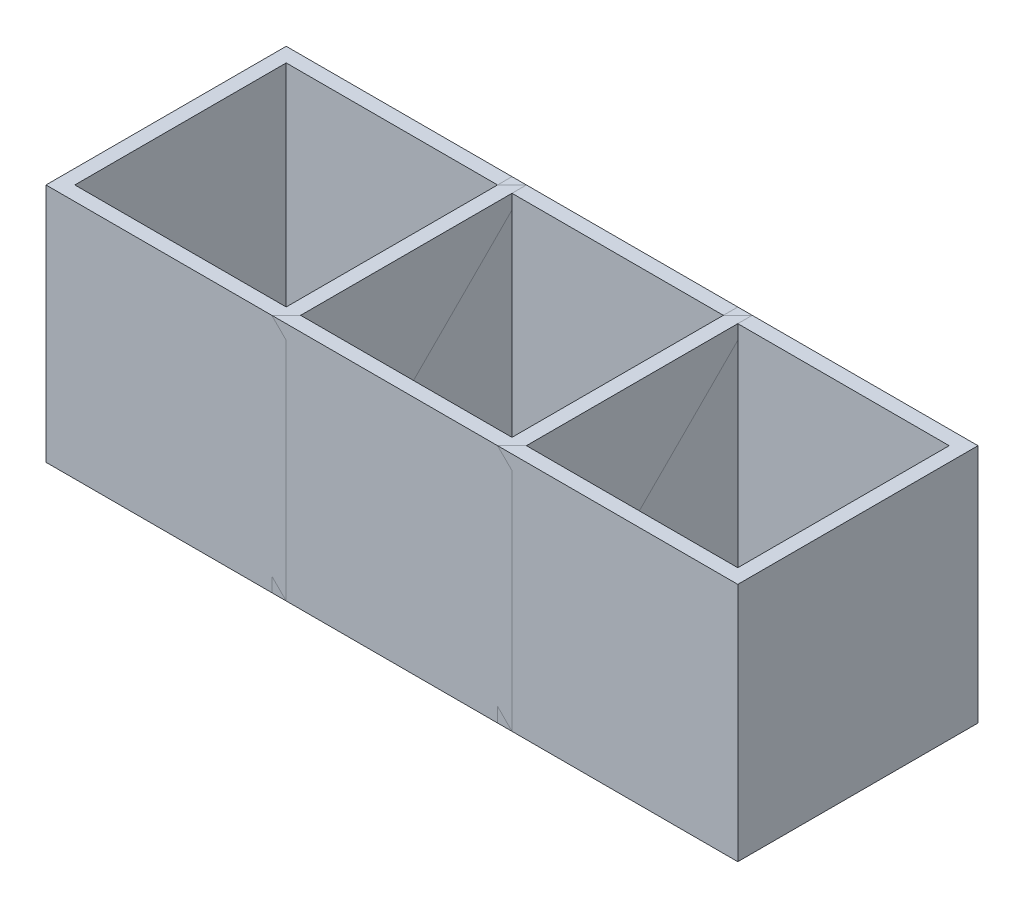
ISO-10303-21;
HEADER;
FILE_DESCRIPTION(('STEP AP214'),'2;1');
FILE_NAME('part.step','',(''),(''),'','','');
FILE_SCHEMA(('AUTOMOTIVE_DESIGN { 1 0 10303 214 1 1 1 1 }'));
ENDSEC;
DATA;
#1=APPLICATION_CONTEXT('core data for automotive mechanical design processes');
#2=APPLICATION_PROTOCOL_DEFINITION('international standard','automotive_design',2000,#1);
#3=PRODUCT_CONTEXT('',#1,'mechanical');
#4=PRODUCT('Part','Part','',(#3));
#5=PRODUCT_RELATED_PRODUCT_CATEGORY('part','',(#4));
#6=PRODUCT_DEFINITION_FORMATION('','',#4);
#7=PRODUCT_DEFINITION_CONTEXT('part definition',#1,'design');
#8=PRODUCT_DEFINITION('design','',#6,#7);
#9=PRODUCT_DEFINITION_SHAPE('','',#8);
#10=(LENGTH_UNIT() NAMED_UNIT(*) SI_UNIT(.MILLI.,.METRE.));
#11=(NAMED_UNIT(*) PLANE_ANGLE_UNIT() SI_UNIT($,.RADIAN.));
#12=(NAMED_UNIT(*) SI_UNIT($,.STERADIAN.) SOLID_ANGLE_UNIT());
#13=UNCERTAINTY_MEASURE_WITH_UNIT(LENGTH_MEASURE(1.E-05),#10,'distance_accuracy_value','');
#14=(GEOMETRIC_REPRESENTATION_CONTEXT(3) GLOBAL_UNCERTAINTY_ASSIGNED_CONTEXT((#13)) GLOBAL_UNIT_ASSIGNED_CONTEXT((#10,
#11,#12)) REPRESENTATION_CONTEXT('',''));
#15=CARTESIAN_POINT('',(0.,0.,0.));
#16=DIRECTION('',(0.,0.,1.));
#17=DIRECTION('',(1.,0.,0.));
#18=AXIS2_PLACEMENT_3D('',#15,#16,#17);
#19=CARTESIAN_POINT('',(69.,50.,-25.));
#20=DIRECTION('',(1.,0.,0.));
#21=DIRECTION('',(0.,0.,-1.));
#22=AXIS2_PLACEMENT_3D('',#19,#20,#21);
#23=PLANE('',#22);
#24=DIRECTION('',(0.,0.,1.));
#25=VECTOR('',#24,1.);
#26=CARTESIAN_POINT('',(69.,0.,-25.));
#27=LINE('',#26,#25);
#28=CARTESIAN_POINT('',(69.,0.,-25.));
#29=VERTEX_POINT('',#28);
#30=CARTESIAN_POINT('',(69.,0.,25.));
#31=VERTEX_POINT('',#30);
#32=EDGE_CURVE('E163',#29,#31,#27,.T.);
#33=ORIENTED_EDGE('',*,*,#32,.T.);
#34=DIRECTION('',(0.,-1.,0.));
#35=VECTOR('',#34,1.);
#36=CARTESIAN_POINT('',(69.,50.,25.));
#37=LINE('',#36,#35);
#38=CARTESIAN_POINT('',(69.,50.,25.));
#39=VERTEX_POINT('',#38);
#40=EDGE_CURVE('E12',#39,#31,#37,.T.);
#41=ORIENTED_EDGE('',*,*,#40,.F.);
#42=DIRECTION('',(0.,0.,1.));
#43=VECTOR('',#42,1.);
#44=CARTESIAN_POINT('',(69.,50.,-25.));
#45=LINE('',#44,#43);
#46=CARTESIAN_POINT('',(69.,50.,-25.));
#47=VERTEX_POINT('',#46);
#48=EDGE_CURVE('E154',#47,#39,#45,.T.);
#49=ORIENTED_EDGE('',*,*,#48,.F.);
#50=DIRECTION('',(0.,-1.,0.));
#51=VECTOR('',#50,1.);
#52=CARTESIAN_POINT('',(69.,50.,-25.));
#53=LINE('',#52,#51);
#54=EDGE_CURVE('E69',#47,#29,#53,.T.);
#55=ORIENTED_EDGE('',*,*,#54,.T.);
#56=EDGE_LOOP('',(#33,#41,#49,#55));
#57=FACE_BOUND('',#56,.T.);
#58=ADVANCED_FACE('F46',(#57),#23,.F.);
#59=CARTESIAN_POINT('',(69.,50.,25.));
#60=DIRECTION('',(0.,0.,-1.));
#61=DIRECTION('',(-1.,0.,0.));
#62=AXIS2_PLACEMENT_3D('',#59,#60,#61);
#63=PLANE('',#62);
#64=DIRECTION('',(1.,0.,0.));
#65=VECTOR('',#64,1.);
#66=CARTESIAN_POINT('',(69.,0.,25.));
#67=LINE('',#66,#65);
#68=CARTESIAN_POINT('',(119.,0.,25.));
#69=VERTEX_POINT('',#68);
#70=EDGE_CURVE('E165',#31,#69,#67,.T.);
#71=ORIENTED_EDGE('',*,*,#70,.T.);
#72=DIRECTION('',(0.,-1.,0.));
#73=VECTOR('',#72,1.);
#74=CARTESIAN_POINT('',(119.,50.,25.));
#75=LINE('',#74,#73);
#76=CARTESIAN_POINT('',(119.,50.,25.));
#77=VERTEX_POINT('',#76);
#78=EDGE_CURVE('E53',#77,#69,#75,.T.);
#79=ORIENTED_EDGE('',*,*,#78,.F.);
#80=DIRECTION('',(1.,0.,0.));
#81=VECTOR('',#80,1.);
#82=CARTESIAN_POINT('',(69.,50.,25.));
#83=LINE('',#82,#81);
#84=EDGE_CURVE('E95',#39,#77,#83,.T.);
#85=ORIENTED_EDGE('',*,*,#84,.F.);
#86=ORIENTED_EDGE('',*,*,#40,.T.);
#87=EDGE_LOOP('',(#71,#79,#85,#86));
#88=FACE_BOUND('',#87,.T.);
#89=ADVANCED_FACE('F179',(#88),#63,.F.);
#90=CARTESIAN_POINT('',(119.,50.,-25.));
#91=DIRECTION('',(1.,0.,0.));
#92=DIRECTION('',(0.,0.,-1.));
#93=AXIS2_PLACEMENT_3D('',#90,#91,#92);
#94=PLANE('',#93);
#95=DIRECTION('',(0.,0.,1.));
#96=VECTOR('',#95,1.);
#97=CARTESIAN_POINT('',(119.,0.,-25.));
#98=LINE('',#97,#96);
#99=CARTESIAN_POINT('',(119.,0.,-25.));
#100=VERTEX_POINT('',#99);
#101=EDGE_CURVE('E168',#100,#69,#98,.T.);
#102=ORIENTED_EDGE('',*,*,#101,.F.);
#103=DIRECTION('',(0.,-1.,0.));
#104=VECTOR('',#103,1.);
#105=CARTESIAN_POINT('',(119.,50.,-25.));
#106=LINE('',#105,#104);
#107=CARTESIAN_POINT('',(119.,50.,-25.));
#108=VERTEX_POINT('',#107);
#109=EDGE_CURVE('E174',#108,#100,#106,.T.);
#110=ORIENTED_EDGE('',*,*,#109,.F.);
#111=DIRECTION('',(0.,0.,1.));
#112=VECTOR('',#111,1.);
#113=CARTESIAN_POINT('',(119.,50.,-25.));
#114=LINE('',#113,#112);
#115=EDGE_CURVE('E158',#108,#77,#114,.T.);
#116=ORIENTED_EDGE('',*,*,#115,.T.);
#117=ORIENTED_EDGE('',*,*,#78,.T.);
#118=EDGE_LOOP('',(#102,#110,#116,#117));
#119=FACE_BOUND('',#118,.T.);
#120=ADVANCED_FACE('F177',(#119),#94,.T.);
#121=CARTESIAN_POINT('',(69.,50.,-25.));
#122=DIRECTION('',(0.,0.,-1.));
#123=DIRECTION('',(-1.,0.,0.));
#124=AXIS2_PLACEMENT_3D('',#121,#122,#123);
#125=PLANE('',#124);
#126=DIRECTION('',(1.,0.,0.));
#127=VECTOR('',#126,1.);
#128=CARTESIAN_POINT('',(69.,0.,-25.));
#129=LINE('',#128,#127);
#130=EDGE_CURVE('E156',#29,#100,#129,.T.);
#131=ORIENTED_EDGE('',*,*,#130,.F.);
#132=ORIENTED_EDGE('',*,*,#54,.F.);
#133=DIRECTION('',(1.,0.,0.));
#134=VECTOR('',#133,1.);
#135=CARTESIAN_POINT('',(69.,50.,-25.));
#136=LINE('',#135,#134);
#137=EDGE_CURVE('E161',#47,#108,#136,.T.);
#138=ORIENTED_EDGE('',*,*,#137,.T.);
#139=ORIENTED_EDGE('',*,*,#109,.T.);
#140=EDGE_LOOP('',(#131,#132,#138,#139));
#141=FACE_BOUND('',#140,.T.);
#142=ADVANCED_FACE('F183',(#141),#125,.T.);
#143=CARTESIAN_POINT('',(94.,50.,0.));
#144=DIRECTION('',(0.,1.,0.));
#145=DIRECTION('',(0.,0.,1.));
#146=AXIS2_PLACEMENT_3D('',#143,#144,#145);
#147=PLANE('',#146);
#148=DIRECTION('',(0.,0.,1.));
#149=VECTOR('',#148,1.);
#150=CARTESIAN_POINT('',(72.,50.,-25.));
#151=LINE('',#150,#149);
#152=CARTESIAN_POINT('',(72.,50.,-22.));
#153=VERTEX_POINT('',#152);
#154=CARTESIAN_POINT('',(72.,50.,22.));
#155=VERTEX_POINT('',#154);
#156=EDGE_CURVE('E144',#153,#155,#151,.T.);
#157=ORIENTED_EDGE('',*,*,#156,.F.);
#158=DIRECTION('',(1.,0.,0.));
#159=VECTOR('',#158,1.);
#160=CARTESIAN_POINT('',(69.,50.,-22.));
#161=LINE('',#160,#159);
#162=CARTESIAN_POINT('',(116.,50.,-22.));
#163=VERTEX_POINT('',#162);
#164=EDGE_CURVE('E125',#153,#163,#161,.T.);
#165=ORIENTED_EDGE('',*,*,#164,.T.);
#166=DIRECTION('',(0.,0.,1.));
#167=VECTOR('',#166,1.);
#168=CARTESIAN_POINT('',(116.,50.,-25.));
#169=LINE('',#168,#167);
#170=CARTESIAN_POINT('',(116.,50.,22.));
#171=VERTEX_POINT('',#170);
#172=EDGE_CURVE('E60',#163,#171,#169,.T.);
#173=ORIENTED_EDGE('',*,*,#172,.T.);
#174=DIRECTION('',(1.,0.,0.));
#175=VECTOR('',#174,1.);
#176=CARTESIAN_POINT('',(69.,50.,22.));
#177=LINE('',#176,#175);
#178=EDGE_CURVE('E146',#155,#171,#177,.T.);
#179=ORIENTED_EDGE('',*,*,#178,.F.);
#180=EDGE_LOOP('',(#157,#165,#173,#179));
#181=FACE_BOUND('',#180,.T.);
#182=ORIENTED_EDGE('',*,*,#48,.T.);
#183=ORIENTED_EDGE('',*,*,#84,.T.);
#184=ORIENTED_EDGE('',*,*,#115,.F.);
#185=ORIENTED_EDGE('',*,*,#137,.F.);
#186=EDGE_LOOP('',(#182,#183,#184,#185));
#187=FACE_BOUND('',#186,.T.);
#188=ADVANCED_FACE('F186',(#181,#187),#147,.T.);
#189=CARTESIAN_POINT('',(94.,0.,0.));
#190=DIRECTION('',(0.,1.,0.));
#191=DIRECTION('',(0.,0.,1.));
#192=AXIS2_PLACEMENT_3D('',#189,#190,#191);
#193=PLANE('',#192);
#194=ORIENTED_EDGE('',*,*,#32,.F.);
#195=ORIENTED_EDGE('',*,*,#130,.T.);
#196=ORIENTED_EDGE('',*,*,#101,.T.);
#197=ORIENTED_EDGE('',*,*,#70,.F.);
#198=EDGE_LOOP('',(#194,#195,#196,#197));
#199=FACE_BOUND('',#198,.T.);
#200=ADVANCED_FACE('F182',(#199),#193,.F.);
#201=CARTESIAN_POINT('',(72.,50.,-25.));
#202=DIRECTION('',(1.,0.,0.));
#203=DIRECTION('',(0.,0.,-1.));
#204=AXIS2_PLACEMENT_3D('',#201,#202,#203);
#205=PLANE('',#204);
#206=DIRECTION('',(0.,0.,1.));
#207=VECTOR('',#206,1.);
#208=CARTESIAN_POINT('',(72.,3.,-25.));
#209=LINE('',#208,#207);
#210=CARTESIAN_POINT('',(72.,3.,-22.));
#211=VERTEX_POINT('',#210);
#212=CARTESIAN_POINT('',(72.,3.,22.));
#213=VERTEX_POINT('',#212);
#214=EDGE_CURVE('E132',#211,#213,#209,.T.);
#215=ORIENTED_EDGE('',*,*,#214,.F.);
#216=DIRECTION('',(0.,-1.,0.));
#217=VECTOR('',#216,1.);
#218=CARTESIAN_POINT('',(72.,50.,-22.));
#219=LINE('',#218,#217);
#220=EDGE_CURVE('E119',#153,#211,#219,.T.);
#221=ORIENTED_EDGE('',*,*,#220,.F.);
#222=ORIENTED_EDGE('',*,*,#156,.T.);
#223=DIRECTION('',(0.,-1.,0.));
#224=VECTOR('',#223,1.);
#225=CARTESIAN_POINT('',(72.,50.,22.));
#226=LINE('',#225,#224);
#227=EDGE_CURVE('E135',#155,#213,#226,.T.);
#228=ORIENTED_EDGE('',*,*,#227,.T.);
#229=EDGE_LOOP('',(#215,#221,#222,#228));
#230=FACE_BOUND('',#229,.T.);
#231=ADVANCED_FACE('F133',(#230),#205,.T.);
#232=CARTESIAN_POINT('',(69.,50.,22.));
#233=DIRECTION('',(0.,0.,-1.));
#234=DIRECTION('',(-1.,0.,0.));
#235=AXIS2_PLACEMENT_3D('',#232,#233,#234);
#236=PLANE('',#235);
#237=DIRECTION('',(1.,0.,0.));
#238=VECTOR('',#237,1.);
#239=CARTESIAN_POINT('',(69.,3.,22.));
#240=LINE('',#239,#238);
#241=CARTESIAN_POINT('',(116.,3.,22.));
#242=VERTEX_POINT('',#241);
#243=EDGE_CURVE('E138',#213,#242,#240,.T.);
#244=ORIENTED_EDGE('',*,*,#243,.F.);
#245=ORIENTED_EDGE('',*,*,#227,.F.);
#246=ORIENTED_EDGE('',*,*,#178,.T.);
#247=DIRECTION('',(0.,-1.,0.));
#248=VECTOR('',#247,1.);
#249=CARTESIAN_POINT('',(116.,50.,22.));
#250=LINE('',#249,#248);
#251=EDGE_CURVE('E278',#171,#242,#250,.T.);
#252=ORIENTED_EDGE('',*,*,#251,.T.);
#253=EDGE_LOOP('',(#244,#245,#246,#252));
#254=FACE_BOUND('',#253,.T.);
#255=ADVANCED_FACE('F210',(#254),#236,.T.);
#256=CARTESIAN_POINT('',(116.,50.,-25.));
#257=DIRECTION('',(1.,0.,0.));
#258=DIRECTION('',(0.,0.,-1.));
#259=AXIS2_PLACEMENT_3D('',#256,#257,#258);
#260=PLANE('',#259);
#261=DIRECTION('',(0.,0.,1.));
#262=VECTOR('',#261,1.);
#263=CARTESIAN_POINT('',(116.,3.,-25.));
#264=LINE('',#263,#262);
#265=CARTESIAN_POINT('',(116.,3.,-22.));
#266=VERTEX_POINT('',#265);
#267=EDGE_CURVE('E143',#266,#242,#264,.T.);
#268=ORIENTED_EDGE('',*,*,#267,.T.);
#269=ORIENTED_EDGE('',*,*,#251,.F.);
#270=ORIENTED_EDGE('',*,*,#172,.F.);
#271=DIRECTION('',(0.,-1.,0.));
#272=VECTOR('',#271,1.);
#273=CARTESIAN_POINT('',(116.,50.,-22.));
#274=LINE('',#273,#272);
#275=EDGE_CURVE('E128',#163,#266,#274,.T.);
#276=ORIENTED_EDGE('',*,*,#275,.T.);
#277=EDGE_LOOP('',(#268,#269,#270,#276));
#278=FACE_BOUND('',#277,.T.);
#279=ADVANCED_FACE('F207',(#278),#260,.F.);
#280=CARTESIAN_POINT('',(69.,50.,-22.));
#281=DIRECTION('',(0.,0.,-1.));
#282=DIRECTION('',(-1.,0.,0.));
#283=AXIS2_PLACEMENT_3D('',#280,#281,#282);
#284=PLANE('',#283);
#285=DIRECTION('',(1.,0.,0.));
#286=VECTOR('',#285,1.);
#287=CARTESIAN_POINT('',(69.,3.,-22.));
#288=LINE('',#287,#286);
#289=EDGE_CURVE('E123',#211,#266,#288,.T.);
#290=ORIENTED_EDGE('',*,*,#289,.T.);
#291=ORIENTED_EDGE('',*,*,#275,.F.);
#292=ORIENTED_EDGE('',*,*,#164,.F.);
#293=ORIENTED_EDGE('',*,*,#220,.T.);
#294=EDGE_LOOP('',(#290,#291,#292,#293));
#295=FACE_BOUND('',#294,.T.);
#296=ADVANCED_FACE('F121',(#295),#284,.F.);
#297=CARTESIAN_POINT('',(94.,3.,0.));
#298=DIRECTION('',(0.,1.,0.));
#299=DIRECTION('',(0.,0.,1.));
#300=AXIS2_PLACEMENT_3D('',#297,#298,#299);
#301=PLANE('',#300);
#302=ORIENTED_EDGE('',*,*,#214,.T.);
#303=ORIENTED_EDGE('',*,*,#243,.T.);
#304=ORIENTED_EDGE('',*,*,#267,.F.);
#305=ORIENTED_EDGE('',*,*,#289,.F.);
#306=EDGE_LOOP('',(#302,#303,#304,#305));
#307=FACE_BOUND('',#306,.T.);
#308=ADVANCED_FACE('F141',(#307),#301,.T.);
#309=CLOSED_SHELL('',(#58,#89,#120,#142,#188,#200,#231,#255,#279,#296,#308));
#310=MANIFOLD_SOLID_BREP('B2',#309);
#311=CARTESIAN_POINT('',(22.,50.,-25.));
#312=DIRECTION('',(1.,0.,0.));
#313=DIRECTION('',(0.,0.,-1.));
#314=AXIS2_PLACEMENT_3D('',#311,#312,#313);
#315=PLANE('',#314);
#316=DIRECTION('',(0.,0.,1.));
#317=VECTOR('',#316,1.);
#318=CARTESIAN_POINT('',(22.,0.,-25.));
#319=LINE('',#318,#317);
#320=CARTESIAN_POINT('',(22.,0.,-25.));
#321=VERTEX_POINT('',#320);
#322=CARTESIAN_POINT('',(22.,0.,25.));
#323=VERTEX_POINT('',#322);
#324=EDGE_CURVE('E411',#321,#323,#319,.T.);
#325=ORIENTED_EDGE('',*,*,#324,.T.);
#326=DIRECTION('',(0.,-1.,0.));
#327=VECTOR('',#326,1.);
#328=CARTESIAN_POINT('',(22.,50.,25.));
#329=LINE('',#328,#327);
#330=CARTESIAN_POINT('',(22.,50.,25.));
#331=VERTEX_POINT('',#330);
#332=EDGE_CURVE('E44',#331,#323,#329,.T.);
#333=ORIENTED_EDGE('',*,*,#332,.F.);
#334=DIRECTION('',(0.,0.,1.));
#335=VECTOR('',#334,1.);
#336=CARTESIAN_POINT('',(22.,50.,-25.));
#337=LINE('',#336,#335);
#338=CARTESIAN_POINT('',(22.,50.,-25.));
#339=VERTEX_POINT('',#338);
#340=EDGE_CURVE('E402',#339,#331,#337,.T.);
#341=ORIENTED_EDGE('',*,*,#340,.F.);
#342=DIRECTION('',(0.,-1.,0.));
#343=VECTOR('',#342,1.);
#344=CARTESIAN_POINT('',(22.,50.,-25.));
#345=LINE('',#344,#343);
#346=EDGE_CURVE('E317',#339,#321,#345,.T.);
#347=ORIENTED_EDGE('',*,*,#346,.T.);
#348=EDGE_LOOP('',(#325,#333,#341,#347));
#349=FACE_BOUND('',#348,.T.);
#350=ADVANCED_FACE('F294',(#349),#315,.F.);
#351=CARTESIAN_POINT('',(22.,50.,25.));
#352=DIRECTION('',(0.,0.,-1.));
#353=DIRECTION('',(-1.,0.,0.));
#354=AXIS2_PLACEMENT_3D('',#351,#352,#353);
#355=PLANE('',#354);
#356=DIRECTION('',(1.,0.,0.));
#357=VECTOR('',#356,1.);
#358=CARTESIAN_POINT('',(22.,0.,25.));
#359=LINE('',#358,#357);
#360=CARTESIAN_POINT('',(72.,0.,25.));
#361=VERTEX_POINT('',#360);
#362=EDGE_CURVE('E413',#323,#361,#359,.T.);
#363=ORIENTED_EDGE('',*,*,#362,.T.);
#364=DIRECTION('',(0.,-1.,0.));
#365=VECTOR('',#364,1.);
#366=CARTESIAN_POINT('',(72.,50.,25.));
#367=LINE('',#366,#365);
#368=CARTESIAN_POINT('',(72.,50.,25.));
#369=VERTEX_POINT('',#368);
#370=EDGE_CURVE('E301',#369,#361,#367,.T.);
#371=ORIENTED_EDGE('',*,*,#370,.F.);
#372=DIRECTION('',(1.,0.,0.));
#373=VECTOR('',#372,1.);
#374=CARTESIAN_POINT('',(22.,50.,25.));
#375=LINE('',#374,#373);
#376=EDGE_CURVE('E343',#331,#369,#375,.T.);
#377=ORIENTED_EDGE('',*,*,#376,.F.);
#378=ORIENTED_EDGE('',*,*,#332,.T.);
#379=EDGE_LOOP('',(#363,#371,#377,#378));
#380=FACE_BOUND('',#379,.T.);
#381=ADVANCED_FACE('F427',(#380),#355,.F.);
#382=CARTESIAN_POINT('',(72.,50.,-25.));
#383=DIRECTION('',(1.,0.,0.));
#384=DIRECTION('',(0.,0.,-1.));
#385=AXIS2_PLACEMENT_3D('',#382,#383,#384);
#386=PLANE('',#385);
#387=DIRECTION('',(0.,0.,1.));
#388=VECTOR('',#387,1.);
#389=CARTESIAN_POINT('',(72.,0.,-25.));
#390=LINE('',#389,#388);
#391=CARTESIAN_POINT('',(72.,0.,-25.));
#392=VERTEX_POINT('',#391);
#393=EDGE_CURVE('E416',#392,#361,#390,.T.);
#394=ORIENTED_EDGE('',*,*,#393,.F.);
#395=DIRECTION('',(0.,-1.,0.));
#396=VECTOR('',#395,1.);
#397=CARTESIAN_POINT('',(72.,50.,-25.));
#398=LINE('',#397,#396);
#399=CARTESIAN_POINT('',(72.,50.,-25.));
#400=VERTEX_POINT('',#399);
#401=EDGE_CURVE('E422',#400,#392,#398,.T.);
#402=ORIENTED_EDGE('',*,*,#401,.F.);
#403=DIRECTION('',(0.,0.,1.));
#404=VECTOR('',#403,1.);
#405=CARTESIAN_POINT('',(72.,50.,-25.));
#406=LINE('',#405,#404);
#407=EDGE_CURVE('E406',#400,#369,#406,.T.);
#408=ORIENTED_EDGE('',*,*,#407,.T.);
#409=ORIENTED_EDGE('',*,*,#370,.T.);
#410=EDGE_LOOP('',(#394,#402,#408,#409));
#411=FACE_BOUND('',#410,.T.);
#412=ADVANCED_FACE('F425',(#411),#386,.T.);
#413=CARTESIAN_POINT('',(22.,50.,-25.));
#414=DIRECTION('',(0.,0.,-1.));
#415=DIRECTION('',(-1.,0.,0.));
#416=AXIS2_PLACEMENT_3D('',#413,#414,#415);
#417=PLANE('',#416);
#418=DIRECTION('',(1.,0.,0.));
#419=VECTOR('',#418,1.);
#420=CARTESIAN_POINT('',(22.,0.,-25.));
#421=LINE('',#420,#419);
#422=EDGE_CURVE('E404',#321,#392,#421,.T.);
#423=ORIENTED_EDGE('',*,*,#422,.F.);
#424=ORIENTED_EDGE('',*,*,#346,.F.);
#425=DIRECTION('',(1.,0.,0.));
#426=VECTOR('',#425,1.);
#427=CARTESIAN_POINT('',(22.,50.,-25.));
#428=LINE('',#427,#426);
#429=EDGE_CURVE('E409',#339,#400,#428,.T.);
#430=ORIENTED_EDGE('',*,*,#429,.T.);
#431=ORIENTED_EDGE('',*,*,#401,.T.);
#432=EDGE_LOOP('',(#423,#424,#430,#431));
#433=FACE_BOUND('',#432,.T.);
#434=ADVANCED_FACE('F431',(#433),#417,.T.);
#435=CARTESIAN_POINT('',(47.,50.,0.));
#436=DIRECTION('',(0.,1.,0.));
#437=DIRECTION('',(0.,0.,1.));
#438=AXIS2_PLACEMENT_3D('',#435,#436,#437);
#439=PLANE('',#438);
#440=DIRECTION('',(0.,0.,1.));
#441=VECTOR('',#440,1.);
#442=CARTESIAN_POINT('',(25.,50.,-25.));
#443=LINE('',#442,#441);
#444=CARTESIAN_POINT('',(25.,50.,-22.));
#445=VERTEX_POINT('',#444);
#446=CARTESIAN_POINT('',(25.,50.,22.));
#447=VERTEX_POINT('',#446);
#448=EDGE_CURVE('E392',#445,#447,#443,.T.);
#449=ORIENTED_EDGE('',*,*,#448,.F.);
#450=DIRECTION('',(1.,0.,0.));
#451=VECTOR('',#450,1.);
#452=CARTESIAN_POINT('',(22.,50.,-22.));
#453=LINE('',#452,#451);
#454=CARTESIAN_POINT('',(69.,50.,-22.));
#455=VERTEX_POINT('',#454);
#456=EDGE_CURVE('E373',#445,#455,#453,.T.);
#457=ORIENTED_EDGE('',*,*,#456,.T.);
#458=DIRECTION('',(0.,0.,1.));
#459=VECTOR('',#458,1.);
#460=CARTESIAN_POINT('',(69.,50.,-25.));
#461=LINE('',#460,#459);
#462=CARTESIAN_POINT('',(69.,50.,22.));
#463=VERTEX_POINT('',#462);
#464=EDGE_CURVE('E308',#455,#463,#461,.T.);
#465=ORIENTED_EDGE('',*,*,#464,.T.);
#466=DIRECTION('',(1.,0.,0.));
#467=VECTOR('',#466,1.);
#468=CARTESIAN_POINT('',(22.,50.,22.));
#469=LINE('',#468,#467);
#470=EDGE_CURVE('E394',#447,#463,#469,.T.);
#471=ORIENTED_EDGE('',*,*,#470,.F.);
#472=EDGE_LOOP('',(#449,#457,#465,#471));
#473=FACE_BOUND('',#472,.T.);
#474=ORIENTED_EDGE('',*,*,#340,.T.);
#475=ORIENTED_EDGE('',*,*,#376,.T.);
#476=ORIENTED_EDGE('',*,*,#407,.F.);
#477=ORIENTED_EDGE('',*,*,#429,.F.);
#478=EDGE_LOOP('',(#474,#475,#476,#477));
#479=FACE_BOUND('',#478,.T.);
#480=ADVANCED_FACE('F434',(#473,#479),#439,.T.);
#481=CARTESIAN_POINT('',(47.,0.,0.));
#482=DIRECTION('',(0.,1.,0.));
#483=DIRECTION('',(0.,0.,1.));
#484=AXIS2_PLACEMENT_3D('',#481,#482,#483);
#485=PLANE('',#484);
#486=ORIENTED_EDGE('',*,*,#324,.F.);
#487=ORIENTED_EDGE('',*,*,#422,.T.);
#488=ORIENTED_EDGE('',*,*,#393,.T.);
#489=ORIENTED_EDGE('',*,*,#362,.F.);
#490=EDGE_LOOP('',(#486,#487,#488,#489));
#491=FACE_BOUND('',#490,.T.);
#492=ADVANCED_FACE('F430',(#491),#485,.F.);
#493=CARTESIAN_POINT('',(25.,50.,-25.));
#494=DIRECTION('',(1.,0.,0.));
#495=DIRECTION('',(0.,0.,-1.));
#496=AXIS2_PLACEMENT_3D('',#493,#494,#495);
#497=PLANE('',#496);
#498=DIRECTION('',(0.,0.,1.));
#499=VECTOR('',#498,1.);
#500=CARTESIAN_POINT('',(25.,3.,-25.));
#501=LINE('',#500,#499);
#502=CARTESIAN_POINT('',(25.,3.,-22.));
#503=VERTEX_POINT('',#502);
#504=CARTESIAN_POINT('',(25.,3.,22.));
#505=VERTEX_POINT('',#504);
#506=EDGE_CURVE('E380',#503,#505,#501,.T.);
#507=ORIENTED_EDGE('',*,*,#506,.F.);
#508=DIRECTION('',(0.,-1.,0.));
#509=VECTOR('',#508,1.);
#510=CARTESIAN_POINT('',(25.,50.,-22.));
#511=LINE('',#510,#509);
#512=EDGE_CURVE('E367',#445,#503,#511,.T.);
#513=ORIENTED_EDGE('',*,*,#512,.F.);
#514=ORIENTED_EDGE('',*,*,#448,.T.);
#515=DIRECTION('',(0.,-1.,0.));
#516=VECTOR('',#515,1.);
#517=CARTESIAN_POINT('',(25.,50.,22.));
#518=LINE('',#517,#516);
#519=EDGE_CURVE('E383',#447,#505,#518,.T.);
#520=ORIENTED_EDGE('',*,*,#519,.T.);
#521=EDGE_LOOP('',(#507,#513,#514,#520));
#522=FACE_BOUND('',#521,.T.);
#523=ADVANCED_FACE('F381',(#522),#497,.T.);
#524=CARTESIAN_POINT('',(22.,50.,22.));
#525=DIRECTION('',(0.,0.,-1.));
#526=DIRECTION('',(-1.,0.,0.));
#527=AXIS2_PLACEMENT_3D('',#524,#525,#526);
#528=PLANE('',#527);
#529=DIRECTION('',(1.,0.,0.));
#530=VECTOR('',#529,1.);
#531=CARTESIAN_POINT('',(22.,3.,22.));
#532=LINE('',#531,#530);
#533=CARTESIAN_POINT('',(69.,3.,22.));
#534=VERTEX_POINT('',#533);
#535=EDGE_CURVE('E386',#505,#534,#532,.T.);
#536=ORIENTED_EDGE('',*,*,#535,.F.);
#537=ORIENTED_EDGE('',*,*,#519,.F.);
#538=ORIENTED_EDGE('',*,*,#470,.T.);
#539=DIRECTION('',(0.,-1.,0.));
#540=VECTOR('',#539,1.);
#541=CARTESIAN_POINT('',(69.,50.,22.));
#542=LINE('',#541,#540);
#543=EDGE_CURVE('E526',#463,#534,#542,.T.);
#544=ORIENTED_EDGE('',*,*,#543,.T.);
#545=EDGE_LOOP('',(#536,#537,#538,#544));
#546=FACE_BOUND('',#545,.T.);
#547=ADVANCED_FACE('F458',(#546),#528,.T.);
#548=CARTESIAN_POINT('',(69.,50.,-25.));
#549=DIRECTION('',(1.,0.,0.));
#550=DIRECTION('',(0.,0.,-1.));
#551=AXIS2_PLACEMENT_3D('',#548,#549,#550);
#552=PLANE('',#551);
#553=DIRECTION('',(0.,0.,1.));
#554=VECTOR('',#553,1.);
#555=CARTESIAN_POINT('',(69.,3.,-25.));
#556=LINE('',#555,#554);
#557=CARTESIAN_POINT('',(69.,3.,-22.));
#558=VERTEX_POINT('',#557);
#559=EDGE_CURVE('E391',#558,#534,#556,.T.);
#560=ORIENTED_EDGE('',*,*,#559,.T.);
#561=ORIENTED_EDGE('',*,*,#543,.F.);
#562=ORIENTED_EDGE('',*,*,#464,.F.);
#563=DIRECTION('',(0.,-1.,0.));
#564=VECTOR('',#563,1.);
#565=CARTESIAN_POINT('',(69.,50.,-22.));
#566=LINE('',#565,#564);
#567=EDGE_CURVE('E376',#455,#558,#566,.T.);
#568=ORIENTED_EDGE('',*,*,#567,.T.);
#569=EDGE_LOOP('',(#560,#561,#562,#568));
#570=FACE_BOUND('',#569,.T.);
#571=ADVANCED_FACE('F455',(#570),#552,.F.);
#572=CARTESIAN_POINT('',(22.,50.,-22.));
#573=DIRECTION('',(0.,0.,-1.));
#574=DIRECTION('',(-1.,0.,0.));
#575=AXIS2_PLACEMENT_3D('',#572,#573,#574);
#576=PLANE('',#575);
#577=DIRECTION('',(1.,0.,0.));
#578=VECTOR('',#577,1.);
#579=CARTESIAN_POINT('',(22.,3.,-22.));
#580=LINE('',#579,#578);
#581=EDGE_CURVE('E371',#503,#558,#580,.T.);
#582=ORIENTED_EDGE('',*,*,#581,.T.);
#583=ORIENTED_EDGE('',*,*,#567,.F.);
#584=ORIENTED_EDGE('',*,*,#456,.F.);
#585=ORIENTED_EDGE('',*,*,#512,.T.);
#586=EDGE_LOOP('',(#582,#583,#584,#585));
#587=FACE_BOUND('',#586,.T.);
#588=ADVANCED_FACE('F369',(#587),#576,.F.);
#589=CARTESIAN_POINT('',(47.,3.,0.));
#590=DIRECTION('',(0.,1.,0.));
#591=DIRECTION('',(0.,0.,1.));
#592=AXIS2_PLACEMENT_3D('',#589,#590,#591);
#593=PLANE('',#592);
#594=ORIENTED_EDGE('',*,*,#506,.T.);
#595=ORIENTED_EDGE('',*,*,#535,.T.);
#596=ORIENTED_EDGE('',*,*,#559,.F.);
#597=ORIENTED_EDGE('',*,*,#581,.F.);
#598=EDGE_LOOP('',(#594,#595,#596,#597));
#599=FACE_BOUND('',#598,.T.);
#600=ADVANCED_FACE('F389',(#599),#593,.T.);
#601=CLOSED_SHELL('',(#350,#381,#412,#434,#480,#492,#523,#547,#571,#588,#600));
#602=MANIFOLD_SOLID_BREP('B6',#601);
#603=CARTESIAN_POINT('',(-25.,50.,-25.));
#604=DIRECTION('',(1.,0.,0.));
#605=DIRECTION('',(0.,0.,-1.));
#606=AXIS2_PLACEMENT_3D('',#603,#604,#605);
#607=PLANE('',#606);
#608=DIRECTION('',(0.,0.,1.));
#609=VECTOR('',#608,1.);
#610=CARTESIAN_POINT('',(-25.,0.,-25.));
#611=LINE('',#610,#609);
#612=CARTESIAN_POINT('',(-25.,0.,-25.));
#613=VERTEX_POINT('',#612);
#614=CARTESIAN_POINT('',(-25.,0.,25.));
#615=VERTEX_POINT('',#614);
#616=EDGE_CURVE('E650',#613,#615,#611,.T.);
#617=ORIENTED_EDGE('',*,*,#616,.T.);
#618=DIRECTION('',(0.,-1.,0.));
#619=VECTOR('',#618,1.);
#620=CARTESIAN_POINT('',(-25.,50.,25.));
#621=LINE('',#620,#619);
#622=CARTESIAN_POINT('',(-25.,50.,25.));
#623=VERTEX_POINT('',#622);
#624=EDGE_CURVE('E292',#623,#615,#621,.T.);
#625=ORIENTED_EDGE('',*,*,#624,.F.);
#626=DIRECTION('',(0.,0.,1.));
#627=VECTOR('',#626,1.);
#628=CARTESIAN_POINT('',(-25.,50.,-25.));
#629=LINE('',#628,#627);
#630=CARTESIAN_POINT('',(-25.,50.,-25.));
#631=VERTEX_POINT('',#630);
#632=EDGE_CURVE('E641',#631,#623,#629,.T.);
#633=ORIENTED_EDGE('',*,*,#632,.F.);
#634=DIRECTION('',(0.,-1.,0.));
#635=VECTOR('',#634,1.);
#636=CARTESIAN_POINT('',(-25.,50.,-25.));
#637=LINE('',#636,#635);
#638=EDGE_CURVE('E556',#631,#613,#637,.T.);
#639=ORIENTED_EDGE('',*,*,#638,.T.);
#640=EDGE_LOOP('',(#617,#625,#633,#639));
#641=FACE_BOUND('',#640,.T.);
#642=ADVANCED_FACE('F533',(#641),#607,.F.);
#643=CARTESIAN_POINT('',(-25.,50.,25.));
#644=DIRECTION('',(0.,0.,-1.));
#645=DIRECTION('',(-1.,0.,0.));
#646=AXIS2_PLACEMENT_3D('',#643,#644,#645);
#647=PLANE('',#646);
#648=DIRECTION('',(1.,0.,0.));
#649=VECTOR('',#648,1.);
#650=CARTESIAN_POINT('',(-25.,0.,25.));
#651=LINE('',#650,#649);
#652=CARTESIAN_POINT('',(25.,0.,25.));
#653=VERTEX_POINT('',#652);
#654=EDGE_CURVE('E652',#615,#653,#651,.T.);
#655=ORIENTED_EDGE('',*,*,#654,.T.);
#656=DIRECTION('',(0.,-1.,0.));
#657=VECTOR('',#656,1.);
#658=CARTESIAN_POINT('',(25.,50.,25.));
#659=LINE('',#658,#657);
#660=CARTESIAN_POINT('',(25.,50.,25.));
#661=VERTEX_POINT('',#660);
#662=EDGE_CURVE('E540',#661,#653,#659,.T.);
#663=ORIENTED_EDGE('',*,*,#662,.F.);
#664=DIRECTION('',(1.,0.,0.));
#665=VECTOR('',#664,1.);
#666=CARTESIAN_POINT('',(-25.,50.,25.));
#667=LINE('',#666,#665);
#668=EDGE_CURVE('E582',#623,#661,#667,.T.);
#669=ORIENTED_EDGE('',*,*,#668,.F.);
#670=ORIENTED_EDGE('',*,*,#624,.T.);
#671=EDGE_LOOP('',(#655,#663,#669,#670));
#672=FACE_BOUND('',#671,.T.);
#673=ADVANCED_FACE('F666',(#672),#647,.F.);
#674=CARTESIAN_POINT('',(25.,50.,-25.));
#675=DIRECTION('',(1.,0.,0.));
#676=DIRECTION('',(0.,0.,-1.));
#677=AXIS2_PLACEMENT_3D('',#674,#675,#676);
#678=PLANE('',#677);
#679=DIRECTION('',(0.,0.,1.));
#680=VECTOR('',#679,1.);
#681=CARTESIAN_POINT('',(25.,0.,-25.));
#682=LINE('',#681,#680);
#683=CARTESIAN_POINT('',(25.,0.,-25.));
#684=VERTEX_POINT('',#683);
#685=EDGE_CURVE('E655',#684,#653,#682,.T.);
#686=ORIENTED_EDGE('',*,*,#685,.F.);
#687=DIRECTION('',(0.,-1.,0.));
#688=VECTOR('',#687,1.);
#689=CARTESIAN_POINT('',(25.,50.,-25.));
#690=LINE('',#689,#688);
#691=CARTESIAN_POINT('',(25.,50.,-25.));
#692=VERTEX_POINT('',#691);
#693=EDGE_CURVE('E661',#692,#684,#690,.T.);
#694=ORIENTED_EDGE('',*,*,#693,.F.);
#695=DIRECTION('',(0.,0.,1.));
#696=VECTOR('',#695,1.);
#697=CARTESIAN_POINT('',(25.,50.,-25.));
#698=LINE('',#697,#696);
#699=EDGE_CURVE('E645',#692,#661,#698,.T.);
#700=ORIENTED_EDGE('',*,*,#699,.T.);
#701=ORIENTED_EDGE('',*,*,#662,.T.);
#702=EDGE_LOOP('',(#686,#694,#700,#701));
#703=FACE_BOUND('',#702,.T.);
#704=ADVANCED_FACE('F664',(#703),#678,.T.);
#705=CARTESIAN_POINT('',(-25.,50.,-25.));
#706=DIRECTION('',(0.,0.,-1.));
#707=DIRECTION('',(-1.,0.,0.));
#708=AXIS2_PLACEMENT_3D('',#705,#706,#707);
#709=PLANE('',#708);
#710=DIRECTION('',(1.,0.,0.));
#711=VECTOR('',#710,1.);
#712=CARTESIAN_POINT('',(-25.,0.,-25.));
#713=LINE('',#712,#711);
#714=EDGE_CURVE('E643',#613,#684,#713,.T.);
#715=ORIENTED_EDGE('',*,*,#714,.F.);
#716=ORIENTED_EDGE('',*,*,#638,.F.);
#717=DIRECTION('',(1.,0.,0.));
#718=VECTOR('',#717,1.);
#719=CARTESIAN_POINT('',(-25.,50.,-25.));
#720=LINE('',#719,#718);
#721=EDGE_CURVE('E648',#631,#692,#720,.T.);
#722=ORIENTED_EDGE('',*,*,#721,.T.);
#723=ORIENTED_EDGE('',*,*,#693,.T.);
#724=EDGE_LOOP('',(#715,#716,#722,#723));
#725=FACE_BOUND('',#724,.T.);
#726=ADVANCED_FACE('F670',(#725),#709,.T.);
#727=CARTESIAN_POINT('',(0.,50.,0.));
#728=DIRECTION('',(0.,1.,0.));
#729=DIRECTION('',(0.,0.,1.));
#730=AXIS2_PLACEMENT_3D('',#727,#728,#729);
#731=PLANE('',#730);
#732=DIRECTION('',(0.,0.,1.));
#733=VECTOR('',#732,1.);
#734=CARTESIAN_POINT('',(-22.,50.,-25.));
#735=LINE('',#734,#733);
#736=CARTESIAN_POINT('',(-22.,50.,-22.));
#737=VERTEX_POINT('',#736);
#738=CARTESIAN_POINT('',(-22.,50.,22.));
#739=VERTEX_POINT('',#738);
#740=EDGE_CURVE('E631',#737,#739,#735,.T.);
#741=ORIENTED_EDGE('',*,*,#740,.F.);
#742=DIRECTION('',(1.,0.,0.));
#743=VECTOR('',#742,1.);
#744=CARTESIAN_POINT('',(-25.,50.,-22.));
#745=LINE('',#744,#743);
#746=CARTESIAN_POINT('',(22.,50.,-22.));
#747=VERTEX_POINT('',#746);
#748=EDGE_CURVE('E612',#737,#747,#745,.T.);
#749=ORIENTED_EDGE('',*,*,#748,.T.);
#750=DIRECTION('',(0.,0.,1.));
#751=VECTOR('',#750,1.);
#752=CARTESIAN_POINT('',(22.,50.,-25.));
#753=LINE('',#752,#751);
#754=CARTESIAN_POINT('',(22.,50.,22.));
#755=VERTEX_POINT('',#754);
#756=EDGE_CURVE('E547',#747,#755,#753,.T.);
#757=ORIENTED_EDGE('',*,*,#756,.T.);
#758=DIRECTION('',(1.,0.,0.));
#759=VECTOR('',#758,1.);
#760=CARTESIAN_POINT('',(-25.,50.,22.));
#761=LINE('',#760,#759);
#762=EDGE_CURVE('E633',#739,#755,#761,.T.);
#763=ORIENTED_EDGE('',*,*,#762,.F.);
#764=EDGE_LOOP('',(#741,#749,#757,#763));
#765=FACE_BOUND('',#764,.T.);
#766=ORIENTED_EDGE('',*,*,#632,.T.);
#767=ORIENTED_EDGE('',*,*,#668,.T.);
#768=ORIENTED_EDGE('',*,*,#699,.F.);
#769=ORIENTED_EDGE('',*,*,#721,.F.);
#770=EDGE_LOOP('',(#766,#767,#768,#769));
#771=FACE_BOUND('',#770,.T.);
#772=ADVANCED_FACE('F673',(#765,#771),#731,.T.);
#773=CARTESIAN_POINT('',(0.,0.,0.));
#774=DIRECTION('',(0.,1.,0.));
#775=DIRECTION('',(0.,0.,1.));
#776=AXIS2_PLACEMENT_3D('',#773,#774,#775);
#777=PLANE('',#776);
#778=ORIENTED_EDGE('',*,*,#616,.F.);
#779=ORIENTED_EDGE('',*,*,#714,.T.);
#780=ORIENTED_EDGE('',*,*,#685,.T.);
#781=ORIENTED_EDGE('',*,*,#654,.F.);
#782=EDGE_LOOP('',(#778,#779,#780,#781));
#783=FACE_BOUND('',#782,.T.);
#784=ADVANCED_FACE('F669',(#783),#777,.F.);
#785=CARTESIAN_POINT('',(-22.,50.,-25.));
#786=DIRECTION('',(1.,0.,0.));
#787=DIRECTION('',(0.,0.,-1.));
#788=AXIS2_PLACEMENT_3D('',#785,#786,#787);
#789=PLANE('',#788);
#790=DIRECTION('',(0.,0.,1.));
#791=VECTOR('',#790,1.);
#792=CARTESIAN_POINT('',(-22.,3.,-25.));
#793=LINE('',#792,#791);
#794=CARTESIAN_POINT('',(-22.,3.,-22.));
#795=VERTEX_POINT('',#794);
#796=CARTESIAN_POINT('',(-22.,3.,22.));
#797=VERTEX_POINT('',#796);
#798=EDGE_CURVE('E619',#795,#797,#793,.T.);
#799=ORIENTED_EDGE('',*,*,#798,.F.);
#800=DIRECTION('',(0.,-1.,0.));
#801=VECTOR('',#800,1.);
#802=CARTESIAN_POINT('',(-22.,50.,-22.));
#803=LINE('',#802,#801);
#804=EDGE_CURVE('E606',#737,#795,#803,.T.);
#805=ORIENTED_EDGE('',*,*,#804,.F.);
#806=ORIENTED_EDGE('',*,*,#740,.T.);
#807=DIRECTION('',(0.,-1.,0.));
#808=VECTOR('',#807,1.);
#809=CARTESIAN_POINT('',(-22.,50.,22.));
#810=LINE('',#809,#808);
#811=EDGE_CURVE('E622',#739,#797,#810,.T.);
#812=ORIENTED_EDGE('',*,*,#811,.T.);
#813=EDGE_LOOP('',(#799,#805,#806,#812));
#814=FACE_BOUND('',#813,.T.);
#815=ADVANCED_FACE('F620',(#814),#789,.T.);
#816=CARTESIAN_POINT('',(-25.,50.,22.));
#817=DIRECTION('',(0.,0.,-1.));
#818=DIRECTION('',(-1.,0.,0.));
#819=AXIS2_PLACEMENT_3D('',#816,#817,#818);
#820=PLANE('',#819);
#821=DIRECTION('',(1.,0.,0.));
#822=VECTOR('',#821,1.);
#823=CARTESIAN_POINT('',(-25.,3.,22.));
#824=LINE('',#823,#822);
#825=CARTESIAN_POINT('',(22.,3.,22.));
#826=VERTEX_POINT('',#825);
#827=EDGE_CURVE('E625',#797,#826,#824,.T.);
#828=ORIENTED_EDGE('',*,*,#827,.F.);
#829=ORIENTED_EDGE('',*,*,#811,.F.);
#830=ORIENTED_EDGE('',*,*,#762,.T.);
#831=DIRECTION('',(0.,-1.,0.));
#832=VECTOR('',#831,1.);
#833=CARTESIAN_POINT('',(22.,50.,22.));
#834=LINE('',#833,#832);
#835=EDGE_CURVE('E765',#755,#826,#834,.T.);
#836=ORIENTED_EDGE('',*,*,#835,.T.);
#837=EDGE_LOOP('',(#828,#829,#830,#836));
#838=FACE_BOUND('',#837,.T.);
#839=ADVANCED_FACE('F697',(#838),#820,.T.);
#840=CARTESIAN_POINT('',(22.,50.,-25.));
#841=DIRECTION('',(1.,0.,0.));
#842=DIRECTION('',(0.,0.,-1.));
#843=AXIS2_PLACEMENT_3D('',#840,#841,#842);
#844=PLANE('',#843);
#845=DIRECTION('',(0.,0.,1.));
#846=VECTOR('',#845,1.);
#847=CARTESIAN_POINT('',(22.,3.,-25.));
#848=LINE('',#847,#846);
#849=CARTESIAN_POINT('',(22.,3.,-22.));
#850=VERTEX_POINT('',#849);
#851=EDGE_CURVE('E630',#850,#826,#848,.T.);
#852=ORIENTED_EDGE('',*,*,#851,.T.);
#853=ORIENTED_EDGE('',*,*,#835,.F.);
#854=ORIENTED_EDGE('',*,*,#756,.F.);
#855=DIRECTION('',(0.,-1.,0.));
#856=VECTOR('',#855,1.);
#857=CARTESIAN_POINT('',(22.,50.,-22.));
#858=LINE('',#857,#856);
#859=EDGE_CURVE('E615',#747,#850,#858,.T.);
#860=ORIENTED_EDGE('',*,*,#859,.T.);
#861=EDGE_LOOP('',(#852,#853,#854,#860));
#862=FACE_BOUND('',#861,.T.);
#863=ADVANCED_FACE('F694',(#862),#844,.F.);
#864=CARTESIAN_POINT('',(-25.,50.,-22.));
#865=DIRECTION('',(0.,0.,-1.));
#866=DIRECTION('',(-1.,0.,0.));
#867=AXIS2_PLACEMENT_3D('',#864,#865,#866);
#868=PLANE('',#867);
#869=DIRECTION('',(1.,0.,0.));
#870=VECTOR('',#869,1.);
#871=CARTESIAN_POINT('',(-25.,3.,-22.));
#872=LINE('',#871,#870);
#873=EDGE_CURVE('E610',#795,#850,#872,.T.);
#874=ORIENTED_EDGE('',*,*,#873,.T.);
#875=ORIENTED_EDGE('',*,*,#859,.F.);
#876=ORIENTED_EDGE('',*,*,#748,.F.);
#877=ORIENTED_EDGE('',*,*,#804,.T.);
#878=EDGE_LOOP('',(#874,#875,#876,#877));
#879=FACE_BOUND('',#878,.T.);
#880=ADVANCED_FACE('F608',(#879),#868,.F.);
#881=CARTESIAN_POINT('',(0.,3.,0.));
#882=DIRECTION('',(0.,1.,0.));
#883=DIRECTION('',(0.,0.,1.));
#884=AXIS2_PLACEMENT_3D('',#881,#882,#883);
#885=PLANE('',#884);
#886=ORIENTED_EDGE('',*,*,#798,.T.);
#887=ORIENTED_EDGE('',*,*,#827,.T.);
#888=ORIENTED_EDGE('',*,*,#851,.F.);
#889=ORIENTED_EDGE('',*,*,#873,.F.);
#890=EDGE_LOOP('',(#886,#887,#888,#889));
#891=FACE_BOUND('',#890,.T.);
#892=ADVANCED_FACE('F628',(#891),#885,.T.);
#893=CLOSED_SHELL('',(#642,#673,#704,#726,#772,#784,#815,#839,#863,#880,#892));
#894=MANIFOLD_SOLID_BREP('B38',#893);
#895=ADVANCED_BREP_SHAPE_REPRESENTATION('',(#18,#310,#602,#894),#14);
#896=SHAPE_DEFINITION_REPRESENTATION(#9,#895);
ENDSEC;
END-ISO-10303-21;
